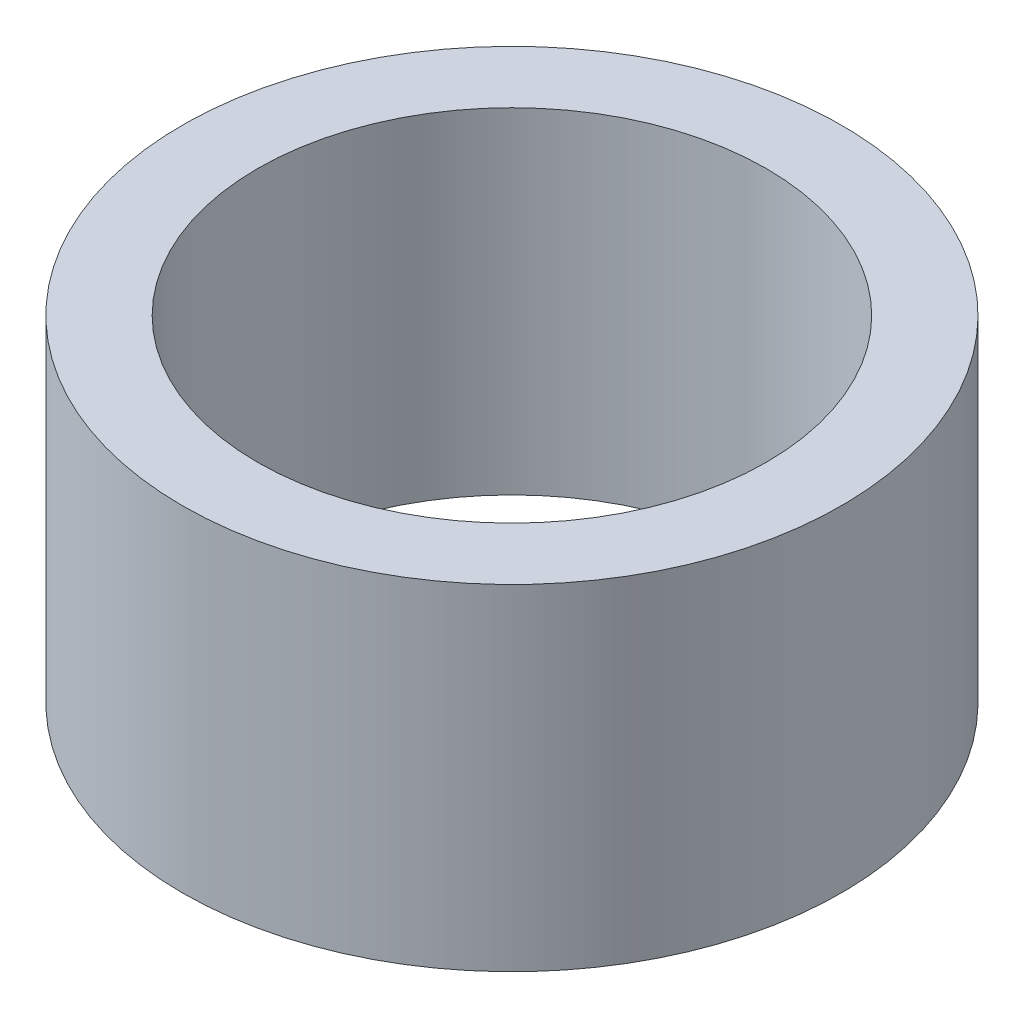
ISO-10303-21;
HEADER;
FILE_DESCRIPTION(('STEP AP214'),'2;1');
FILE_NAME('part.step','',(''),(''),'','','');
FILE_SCHEMA(('AUTOMOTIVE_DESIGN { 1 0 10303 214 1 1 1 1 }'));
ENDSEC;
DATA;
#1=APPLICATION_CONTEXT('core data for automotive mechanical design processes');
#2=APPLICATION_PROTOCOL_DEFINITION('international standard','automotive_design',2000,#1);
#3=PRODUCT_CONTEXT('',#1,'mechanical');
#4=PRODUCT('Part','Part','',(#3));
#5=PRODUCT_RELATED_PRODUCT_CATEGORY('part','',(#4));
#6=PRODUCT_DEFINITION_FORMATION('','',#4);
#7=PRODUCT_DEFINITION_CONTEXT('part definition',#1,'design');
#8=PRODUCT_DEFINITION('design','',#6,#7);
#9=PRODUCT_DEFINITION_SHAPE('','',#8);
#10=(LENGTH_UNIT() NAMED_UNIT(*) SI_UNIT(.MILLI.,.METRE.));
#11=(NAMED_UNIT(*) PLANE_ANGLE_UNIT() SI_UNIT($,.RADIAN.));
#12=(NAMED_UNIT(*) SI_UNIT($,.STERADIAN.) SOLID_ANGLE_UNIT());
#13=UNCERTAINTY_MEASURE_WITH_UNIT(LENGTH_MEASURE(1.E-05),#10,'distance_accuracy_value','');
#14=(GEOMETRIC_REPRESENTATION_CONTEXT(3) GLOBAL_UNCERTAINTY_ASSIGNED_CONTEXT((#13)) GLOBAL_UNIT_ASSIGNED_CONTEXT((#10,
#11,#12)) REPRESENTATION_CONTEXT('',''));
#15=CARTESIAN_POINT('',(0.,0.,0.));
#16=DIRECTION('',(0.,0.,1.));
#17=DIRECTION('',(1.,0.,0.));
#18=AXIS2_PLACEMENT_3D('',#15,#16,#17);
#19=CARTESIAN_POINT('',(0.,29.,0.));
#20=DIRECTION('',(0.,1.,0.));
#21=DIRECTION('',(0.,0.,1.));
#22=AXIS2_PLACEMENT_3D('',#19,#20,#21);
#23=PLANE('',#22);
#24=CARTESIAN_POINT('',(0.,29.,0.));
#25=DIRECTION('',(0.,1.,0.));
#26=DIRECTION('',(0.,0.,1.));
#27=AXIS2_PLACEMENT_3D('',#24,#25,#26);
#28=CIRCLE('',#27,28.5);
#29=CARTESIAN_POINT('',(0.,29.,28.5));
#30=VERTEX_POINT('',#29);
#31=EDGE_CURVE('E10',#30,#30,#28,.T.);
#32=ORIENTED_EDGE('',*,*,#31,.T.);
#33=EDGE_LOOP('',(#32));
#34=FACE_BOUND('',#33,.T.);
#35=CARTESIAN_POINT('',(0.,29.,0.));
#36=DIRECTION('',(0.,1.,0.));
#37=DIRECTION('',(0.,0.,1.));
#38=AXIS2_PLACEMENT_3D('',#35,#36,#37);
#39=CIRCLE('',#38,22.);
#40=CARTESIAN_POINT('',(0.,29.,22.));
#41=VERTEX_POINT('',#40);
#42=EDGE_CURVE('E50',#41,#41,#39,.T.);
#43=ORIENTED_EDGE('',*,*,#42,.F.);
#44=EDGE_LOOP('',(#43));
#45=FACE_BOUND('',#44,.T.);
#46=ADVANCED_FACE('F37',(#34,#45),#23,.T.);
#47=CARTESIAN_POINT('',(0.,0.,0.));
#48=DIRECTION('',(0.,1.,0.));
#49=DIRECTION('',(0.,0.,1.));
#50=AXIS2_PLACEMENT_3D('',#47,#48,#49);
#51=PLANE('',#50);
#52=CARTESIAN_POINT('',(0.,0.,0.));
#53=DIRECTION('',(0.,1.,0.));
#54=DIRECTION('',(0.,0.,1.));
#55=AXIS2_PLACEMENT_3D('',#52,#53,#54);
#56=CIRCLE('',#55,28.5);
#57=CARTESIAN_POINT('',(0.,0.,28.5));
#58=VERTEX_POINT('',#57);
#59=EDGE_CURVE('E41',#58,#58,#56,.T.);
#60=ORIENTED_EDGE('',*,*,#59,.F.);
#61=EDGE_LOOP('',(#60));
#62=FACE_BOUND('',#61,.T.);
#63=CARTESIAN_POINT('',(0.,0.,0.));
#64=DIRECTION('',(0.,1.,0.));
#65=DIRECTION('',(0.,0.,1.));
#66=AXIS2_PLACEMENT_3D('',#63,#64,#65);
#67=CIRCLE('',#66,22.);
#68=CARTESIAN_POINT('',(0.,0.,22.));
#69=VERTEX_POINT('',#68);
#70=EDGE_CURVE('E52',#69,#69,#67,.T.);
#71=ORIENTED_EDGE('',*,*,#70,.T.);
#72=EDGE_LOOP('',(#71));
#73=FACE_BOUND('',#72,.T.);
#74=ADVANCED_FACE('F64',(#62,#73),#51,.F.);
#75=CARTESIAN_POINT('',(0.,29.,0.));
#76=DIRECTION('',(0.,-1.,0.));
#77=DIRECTION('',(0.,0.,-1.));
#78=AXIS2_PLACEMENT_3D('',#75,#76,#77);
#79=CYLINDRICAL_SURFACE('',#78,28.5);
#80=ORIENTED_EDGE('',*,*,#31,.F.);
#81=EDGE_LOOP('',(#80));
#82=FACE_BOUND('',#81,.T.);
#83=ORIENTED_EDGE('',*,*,#59,.T.);
#84=EDGE_LOOP('',(#83));
#85=FACE_BOUND('',#84,.T.);
#86=ADVANCED_FACE('F39',(#82,#85),#79,.T.);
#87=CARTESIAN_POINT('',(0.,29.,0.));
#88=DIRECTION('',(0.,-1.,0.));
#89=DIRECTION('',(0.,0.,-1.));
#90=AXIS2_PLACEMENT_3D('',#87,#88,#89);
#91=CYLINDRICAL_SURFACE('',#90,22.);
#92=ORIENTED_EDGE('',*,*,#42,.T.);
#93=EDGE_LOOP('',(#92));
#94=FACE_BOUND('',#93,.T.);
#95=ORIENTED_EDGE('',*,*,#70,.F.);
#96=EDGE_LOOP('',(#95));
#97=FACE_BOUND('',#96,.T.);
#98=ADVANCED_FACE('F60',(#94,#97),#91,.F.);
#99=CLOSED_SHELL('',(#46,#74,#86,#98));
#100=MANIFOLD_SOLID_BREP('B2',#99);
#101=ADVANCED_BREP_SHAPE_REPRESENTATION('',(#18,#100),#14);
#102=SHAPE_DEFINITION_REPRESENTATION(#9,#101);
ENDSEC;
END-ISO-10303-21;
